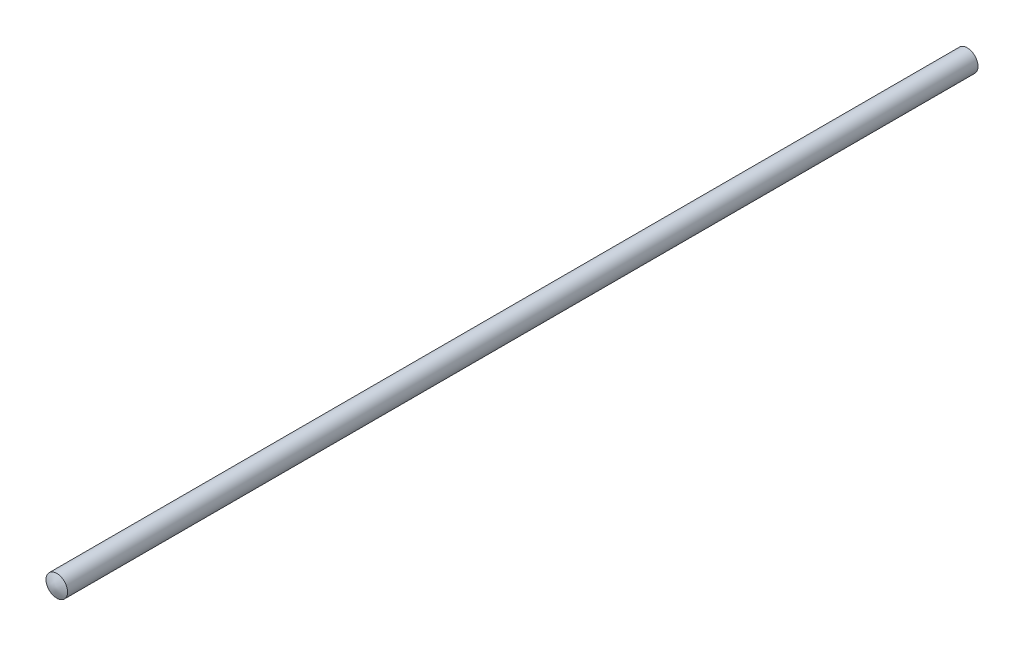
ISO-10303-21;
HEADER;
FILE_DESCRIPTION(('STEP AP214'),'2;1');
FILE_NAME('part.step','',(''),(''),'','','');
FILE_SCHEMA(('AUTOMOTIVE_DESIGN { 1 0 10303 214 1 1 1 1 }'));
ENDSEC;
DATA;
#1=APPLICATION_CONTEXT('core data for automotive mechanical design processes');
#2=APPLICATION_PROTOCOL_DEFINITION('international standard','automotive_design',2000,#1);
#3=PRODUCT_CONTEXT('',#1,'mechanical');
#4=PRODUCT('Part','Part','',(#3));
#5=PRODUCT_RELATED_PRODUCT_CATEGORY('part','',(#4));
#6=PRODUCT_DEFINITION_FORMATION('','',#4);
#7=PRODUCT_DEFINITION_CONTEXT('part definition',#1,'design');
#8=PRODUCT_DEFINITION('design','',#6,#7);
#9=PRODUCT_DEFINITION_SHAPE('','',#8);
#10=(LENGTH_UNIT() NAMED_UNIT(*) SI_UNIT(.MILLI.,.METRE.));
#11=(NAMED_UNIT(*) PLANE_ANGLE_UNIT() SI_UNIT($,.RADIAN.));
#12=(NAMED_UNIT(*) SI_UNIT($,.STERADIAN.) SOLID_ANGLE_UNIT());
#13=UNCERTAINTY_MEASURE_WITH_UNIT(LENGTH_MEASURE(1.E-05),#10,'distance_accuracy_value','');
#14=(GEOMETRIC_REPRESENTATION_CONTEXT(3) GLOBAL_UNCERTAINTY_ASSIGNED_CONTEXT((#13)) GLOBAL_UNIT_ASSIGNED_CONTEXT((#10,
#11,#12)) REPRESENTATION_CONTEXT('',''));
#15=CARTESIAN_POINT('',(0.,0.,0.));
#16=DIRECTION('',(0.,0.,1.));
#17=DIRECTION('',(1.,0.,0.));
#18=AXIS2_PLACEMENT_3D('',#15,#16,#17);
#19=CARTESIAN_POINT('',(0.,1.11022302462516E-13,268.));
#20=DIRECTION('',(0.,0.,-1.));
#21=DIRECTION('',(-1.,0.,0.));
#22=AXIS2_PLACEMENT_3D('',#19,#20,#21);
#23=CYLINDRICAL_SURFACE('',#22,6.35);
#24=CARTESIAN_POINT('',(-6.34999999999719,-1.55431223447522E-12,268.000096406483));
#25=CARTESIAN_POINT('',(-6.35000128044911,-0.178405354103465,268.000095801648));
#26=CARTESIAN_POINT('',(-6.34247837398455,-0.356789699393443,268.000106324726));
#27=CARTESIAN_POINT('',(-6.3124392573701,-0.712350020998407,268.00013407479));
#28=CARTESIAN_POINT('',(-6.28991910287816,-0.889525667032637,268.000151303539));
#29=CARTESIAN_POINT('',(-6.23001326713247,-1.24150541697179,268.000149018285));
#30=CARTESIAN_POINT('',(-6.19261434982376,-1.41630726559039,268.000129471508));
#31=CARTESIAN_POINT('',(-6.10320132114421,-1.76220134522993,268.000085831834));
#32=CARTESIAN_POINT('',(-6.05118186583848,-1.93329219517198,268.000061737275));
#33=CARTESIAN_POINT('',(-5.93295397138,-2.27033579232568,268.000040936433));
#34=CARTESIAN_POINT('',(-5.86675759671156,-2.43629277185692,268.000044206951));
#35=CARTESIAN_POINT('',(-5.72059302178718,-2.76210175417579,268.000063981226));
#36=CARTESIAN_POINT('',(-5.64061968339386,-2.92195145197132,268.000080489927));
#37=CARTESIAN_POINT('',(-5.46754457787675,-3.23423947736638,268.000114014888));
#38=CARTESIAN_POINT('',(-5.37445153748528,-3.38668264160138,268.000131030804));
#39=CARTESIAN_POINT('',(-5.17571341101149,-3.6832550926358,268.000159153254));
#40=CARTESIAN_POINT('',(-5.07006265776027,-3.82738058183333,268.000170257107));
#41=CARTESIAN_POINT('',(-4.84698238495348,-4.10623256862649,268.000186513628));
#42=CARTESIAN_POINT('',(-4.72955163297828,-4.24095808029434,268.000191665673));
#43=CARTESIAN_POINT('',(-4.4838115392967,-4.49997659868937,268.000197052873));
#44=CARTESIAN_POINT('',(-4.35550714750611,-4.62427430164526,268.000197290253));
#45=CARTESIAN_POINT('',(-4.0888251778504,-4.86167591883434,268.000192049633));
#46=CARTESIAN_POINT('',(-3.9504430631059,-4.97477473671141,268.000186569044));
#47=CARTESIAN_POINT('',(-3.66469484160733,-5.1888700178347,268.000168404349));
#48=CARTESIAN_POINT('',(-3.51733211562199,-5.28987099339232,268.000155722939));
#49=CARTESIAN_POINT('',(-3.21456961515029,-5.47913541811532,268.000125361114));
#50=CARTESIAN_POINT('',(-3.05916701950378,-5.56739435440086,268.000107678934));
#51=CARTESIAN_POINT('',(-2.7415367014403,-5.73047430947266,268.000077780013));
#52=CARTESIAN_POINT('',(-2.57931152158411,-5.80530028047754,268.000065561255));
#53=CARTESIAN_POINT('',(-2.2491050298462,-5.94103504620717,268.000060599971));
#54=CARTESIAN_POINT('',(-2.08112267136192,-6.00194129485516,268.000067861005));
#55=CARTESIAN_POINT('',(-1.74062422022812,-6.10938607651981,268.000108662651));
#56=CARTESIAN_POINT('',(-1.56810812757804,-6.15592460953471,268.000142203262));
#57=CARTESIAN_POINT('',(-1.21976835283598,-6.23430318215571,268.000176704424));
#58=CARTESIAN_POINT('',(-1.04394466476752,-6.26614319520047,268.000177664915));
#59=CARTESIAN_POINT('',(-0.690240014959518,-6.31489823611969,268.00015853037));
#60=CARTESIAN_POINT('',(-0.512359053216305,-6.33181326396757,268.000138435333));
#61=CARTESIAN_POINT('',(-0.155804802612847,-6.35059806281717,268.000115503974));
#62=CARTESIAN_POINT('',(0.0228684848161311,-6.35246786098573,268.000112667621));
#63=CARTESIAN_POINT('',(0.37973744518868,-6.34114897839931,268.00012734329));
#64=CARTESIAN_POINT('',(0.557933118133068,-6.32796029767009,268.000144855311));
#65=CARTESIAN_POINT('',(0.912580057989008,-6.28661821288181,268.000172443957));
#66=CARTESIAN_POINT('',(1.08903132424237,-6.25846480317653,268.00018252058));
#67=CARTESIAN_POINT('',(1.43893491855304,-6.18739341051373,268.000160174334));
#68=CARTESIAN_POINT('',(1.61238724659973,-6.14447542750388,268.000127751465));
#69=CARTESIAN_POINT('',(1.95506000452752,-6.04417995815779,268.000080721031));
#70=CARTESIAN_POINT('',(2.12428042994984,-5.98680245658748,268.000066113484));
#71=CARTESIAN_POINT('',(2.45728615113507,-5.85799588120962,268.000060242739));
#72=CARTESIAN_POINT('',(2.62107144690616,-5.78656680742321,268.00006897954));
#73=CARTESIAN_POINT('',(2.94201233270917,-5.63017961448241,268.00009531583));
#74=CARTESIAN_POINT('',(3.09916916027457,-5.54522403499283,268.000112913656));
#75=CARTESIAN_POINT('',(3.40582633604658,-5.36234368642265,268.000144916558));
#76=CARTESIAN_POINT('',(3.55532379587368,-5.26441407397773,268.000159320436));
#77=CARTESIAN_POINT('',(3.84547557789217,-5.0563498819842,268.000180905236));
#78=CARTESIAN_POINT('',(3.98613353557804,-4.94622037215953,268.000188089145));
#79=CARTESIAN_POINT('',(4.25773581982436,-4.71445341684494,268.000196304423));
#80=CARTESIAN_POINT('',(4.38867571567909,-4.59281077904374,268.000197333002));
#81=CARTESIAN_POINT('',(4.63984011021247,-4.33892488552416,268.000194476317));
#82=CARTESIAN_POINT('',(4.76006460534527,-4.20668162629794,268.000190591052));
#83=CARTESIAN_POINT('',(4.98889115860331,-3.93259730485286,268.000177191566));
#84=CARTESIAN_POINT('',(5.09749845648826,-3.7907606171263,268.000167679897));
#85=CARTESIAN_POINT('',(5.30242367347464,-3.49838334469239,268.000142357172));
#86=CARTESIAN_POINT('',(5.39873648733996,-3.34783918170149,268.000126543511));
#87=CARTESIAN_POINT('',(5.57830141571896,-3.03922891557393,268.000093008299));
#88=CARTESIAN_POINT('',(5.66155840445128,-2.88116564845726,268.000075287464));
#89=CARTESIAN_POINT('',(5.81447774706051,-2.55855808077407,268.000049756971));
#90=CARTESIAN_POINT('',(5.88413755372414,-2.39401257278945,268.000041949168));
#91=CARTESIAN_POINT('',(6.00934784725865,-2.05963817874094,268.000050728739));
#92=CARTESIAN_POINT('',(6.06489833409647,-1.88980929266469,268.000067316113));
#93=CARTESIAN_POINT('',(6.16149506649238,-1.54607551536307,268.000112167783));
#94=CARTESIAN_POINT('',(6.2025413126803,-1.37217062431472,268.000140432078));
#95=CARTESIAN_POINT('',(6.26983775035469,-1.02152119126335,268.000156178578));
#96=CARTESIAN_POINT('',(6.29608794186501,-0.844776649264917,268.000143660783));
#97=CARTESIAN_POINT('',(6.33360564411269,-0.489704494952109,268.000116876781));
#98=CARTESIAN_POINT('',(6.34487315749947,-0.311376882917679,268.000102610575));
#99=CARTESIAN_POINT('',(6.35234540677523,0.0455936422165156,268.000093588381));
#100=CARTESIAN_POINT('',(6.34855014265971,0.224236555316374,268.000098832393));
#101=CARTESIAN_POINT('',(6.32592381878535,0.580567644878638,268.00012280646));
#102=CARTESIAN_POINT('',(6.30709275833806,0.758255821297329,268.000141536516));
#103=CARTESIAN_POINT('',(6.25452871736142,1.11141417665586,268.000152213018));
#104=CARTESIAN_POINT('',(6.22079573684664,1.28688435559786,268.000144159465));
#105=CARTESIAN_POINT('',(6.13866767781263,1.63435923263122,268.000106266317));
#106=CARTESIAN_POINT('',(6.09027259824489,1.80636393047475,268.00007642672));
#107=CARTESIAN_POINT('',(5.97916439014131,2.1456850043661,268.000044334604));
#108=CARTESIAN_POINT('',(5.91645126164024,2.31300138042531,268.000042082084));
#109=CARTESIAN_POINT('',(5.77716571543426,2.64172585672441,268.000054281404));
#110=CARTESIAN_POINT('',(5.70059586031722,2.8031350427836,268.000068730159));
#111=CARTESIAN_POINT('',(5.53410246561002,3.11898902968556,268.00010103757));
#112=CARTESIAN_POINT('',(5.44417400496736,3.27343123657836,268.000118897483));
#113=CARTESIAN_POINT('',(5.25165953228186,3.57413365525464,268.000149473351));
#114=CARTESIAN_POINT('',(5.14907820686649,3.72039686754073,268.000162191202));
#115=CARTESIAN_POINT('',(4.93192063415114,4.0038158672111,268.000181412434));
#116=CARTESIAN_POINT('',(4.81733997223598,4.14096827214091,268.000187913519));
#117=CARTESIAN_POINT('',(4.57707432231983,4.40508228156732,268.000195858094));
#118=CARTESIAN_POINT('',(4.45139344364149,4.53204762439025,268.000197303449));
#119=CARTESIAN_POINT('',(4.18973601270205,4.77498636732874,268.000194861082));
#120=CARTESIAN_POINT('',(4.0537556764025,4.89095569190481,268.000190971391));
#121=CARTESIAN_POINT('',(3.77255916155188,5.1109839230657,268.000176216915));
#122=CARTESIAN_POINT('',(3.62734640584466,5.21504720412154,268.000165354701));
#123=CARTESIAN_POINT('',(3.32861673459316,5.41060933056712,268.000137423009));
#124=CARTESIAN_POINT('',(3.17509677287339,5.50210352286921,268.000120351241));
#125=CARTESIAN_POINT('',(2.86095193734431,5.67179982252483,268.000088397309));
#126=CARTESIAN_POINT('',(2.70032971514227,5.7500068386722,268.000073514336));
#127=CARTESIAN_POINT('',(2.37300833875286,5.89264066931354,268.000059594805));
#128=CARTESIAN_POINT('',(2.2063069614118,5.9570623821417,268.000060564103));
#129=CARTESIAN_POINT('',(1.86813202464055,6.07160948774153,268.000091073785));
#130=CARTESIAN_POINT('',(1.69666026432286,6.12174019213395,268.000120603537));
#131=CARTESIAN_POINT('',(1.35003874039485,6.20739705177218,268.000163934263));
#132=CARTESIAN_POINT('',(1.17488762424494,6.24291773398119,268.000177729346));
#133=CARTESIAN_POINT('',(0.822288059488215,6.2990633413381,268.000171159408));
#134=CARTESIAN_POINT('',(0.644840586481541,6.31969439366234,268.000150808449));
#135=CARTESIAN_POINT('',(0.288757748489359,6.34594393037993,268.000122088804));
#136=CARTESIAN_POINT('',(0.110121881647268,6.35155560757303,268.000113725552));
#137=CARTESIAN_POINT('',(-0.246987092049549,6.34770688732131,268.000118865595));
#138=CARTESIAN_POINT('',(-0.425460199196028,6.33824651694703,268.00013236885));
#139=CARTESIAN_POINT('',(-0.780893952307786,6.30432876135995,268.000163023849));
#140=CARTESIAN_POINT('',(-0.95785524672531,6.27987817097655,268.000180173937));
#141=CARTESIAN_POINT('',(-1.30916289617733,6.21614634665356,268.000171941768));
#142=CARTESIAN_POINT('',(-1.48350813351879,6.17685895139737,268.000146541826));
#143=CARTESIAN_POINT('',(-1.82820374464671,6.08375132870037,268.000098702034));
#144=CARTESIAN_POINT('',(-1.99855558859273,6.02993654379511,268.00007626108));
#145=CARTESIAN_POINT('',(-2.33418695063881,5.90812620078526,268.000058247329));
#146=CARTESIAN_POINT('',(-2.49946446179279,5.84012511268158,268.000062685029));
#147=CARTESIAN_POINT('',(-2.82364201922553,5.69046625966567,268.000083836489));
#148=CARTESIAN_POINT('',(-2.98254439830485,5.60881354775333,268.000100545715));
#149=CARTESIAN_POINT('',(-3.29295831571037,5.43238501444194,268.000133157001));
#150=CARTESIAN_POINT('',(-3.44446739764313,5.3376048711143,268.000149058794));
#151=CARTESIAN_POINT('',(-3.73890656553081,5.13565338548851,268.000173930542));
#152=CARTESIAN_POINT('',(-3.88183979754855,5.02848662998301,268.000182903054));
#153=CARTESIAN_POINT('',(-4.1582088291503,4.80246541356236,268.000194258049));
#154=CARTESIAN_POINT('',(-4.29164210937315,4.68360787203839,268.000196638791));
#155=CARTESIAN_POINT('',(-4.547973494064,4.43511988942894,268.000196348411));
#156=CARTESIAN_POINT('',(-4.67087546705592,4.30549343890768,268.000193679154));
#157=CARTESIAN_POINT('',(-4.9053986790255,4.03626737587944,268.000183026175));
#158=CARTESIAN_POINT('',(-5.01701290008786,3.89666164991002,268.000175039171));
#159=CARTESIAN_POINT('',(-5.22804103356964,3.60859450165775,268.000152700593));
#160=CARTESIAN_POINT('',(-5.32745942725098,3.4601363621033,268.000138351366));
#161=CARTESIAN_POINT('',(-5.51351589761563,3.15524375001055,268.000105832891));
#162=CARTESIAN_POINT('',(-5.60014309436264,2.99880263775733,268.000087660424));
#163=CARTESIAN_POINT('',(-5.75987045980536,2.67923329490444,268.00005803331));
#164=CARTESIAN_POINT('',(-5.83297556247695,2.51610753006272,268.00004657621));
#165=CARTESIAN_POINT('',(-5.96511918419794,2.18442014022354,268.00004413271));
#166=CARTESIAN_POINT('',(-6.02417017741873,2.01586348762059,268.000053128081));
#167=CARTESIAN_POINT('',(-6.12785491177576,1.6744327375732,268.000094305633));
#168=CARTESIAN_POINT('',(-6.17249244111451,1.501559787444,268.000126481715));
#169=CARTESIAN_POINT('',(-6.25633862735126,1.10921046909331,268.000157149938));
#170=CARTESIAN_POINT('',(-6.29143183547369,0.888842562761136,268.000145266861));
#171=CARTESIAN_POINT('',(-6.3382617222534,0.445638848839426,268.00011527281));
#172=CARTESIAN_POINT('',(-6.34999840089394,0.22280304124812,268.000097161836));
#173=CARTESIAN_POINT('',(-6.34999999999719,-1.55431223447522E-12,268.000096406483));
#174=B_SPLINE_CURVE_WITH_KNOTS('',3,(#24,#25,#26,#27,#28,#29,#30,#31,#32,#33,#34,#35,#36,#37,
#38,#39,#40,#41,#42,#43,#44,#45,#46,#47,#48,#49,#50,#51,#52,#53,#54,#55,#56,#57,#58,#59,#60,#61,
#62,#63,#64,#65,#66,#67,#68,#69,#70,#71,#72,#73,#74,#75,#76,#77,#78,#79,#80,#81,#82,#83,#84,#85,
#86,#87,#88,#89,#90,#91,#92,#93,#94,#95,#96,#97,#98,#99,#100,#101,#102,#103,#104,#105,#106,#107,
#108,#109,#110,#111,#112,#113,#114,#115,#116,#117,#118,#119,#120,#121,#122,#123,#124,#125,#126,
#127,#128,#129,#130,#131,#132,#133,#134,#135,#136,#137,#138,#139,#140,#141,#142,#143,#144,#145,
#146,#147,#148,#149,#150,#151,#152,#153,#154,#155,#156,#157,#158,#159,#160,#161,#162,#163,#164,
#165,#166,#167,#168,#169,#170,#171,#172,#173),.UNSPECIFIED.,.T.,.F.,(4,2,2,2,2,2,2,2,2,2,2,2,2,
2,2,2,2,2,2,2,2,2,2,2,2,2,2,2,2,2,2,2,2,2,2,2,2,2,2,2,2,2,2,2,2,2,2,2,2,2,2,2,2,2,2,2,2,2,2,2,2,
2,2,2,2,2,2,2,2,2,2,2,2,2,4),(0.,0.535021449120727,1.07018366683247,1.60582302989691,
2.14165842902484,2.67703963419656,3.21262094451063,3.7478476730991,4.28331686779797,
4.8188421416505,5.35412492898694,5.88965020239996,6.4249751068961,6.96048914605857,
7.4958053545066,8.03121940019943,8.56663344595775,9.10204845924639,9.63746347348854,
10.1728775209437,10.7082915674829,11.2437058160348,11.779120066484,12.3145348810297,
12.8499496947695,13.3852641001565,13.9207789110146,14.4560720151313,14.991607692234,
15.5271435465512,16.0624368279235,16.5979516696218,17.133266105537,17.6686807279563,
18.2040953516297,18.7395099520533,19.2749245516136,19.8103390564948,20.3457535615358,
20.8811680910917,21.4165826201238,21.9519971874448,22.487411753466,23.0227274038196,
23.5582407454219,24.093556324932,24.6290695462215,25.1643853438134,25.6998987803731,
26.2352148245412,26.7707285121895,27.306043928249,27.8415571125492,28.3768709993269,
28.9123852369348,29.4476789812204,29.983215294529,30.518750645975,31.0540434270183,
31.589558745293,32.1248737160816,32.6603977505905,33.1957240037674,33.7312269225723,
34.2665321748408,34.8019788638455,35.3372280134244,35.8728079227482,36.408190444157,
36.9440257599547,37.4796651714432,38.014827371181,38.5498488028115,39.2180148817535,
39.886180961174),.UNSPECIFIED.);
#175=CARTESIAN_POINT('',(-6.34999999999719,-1.55431223447522E-12,268.000096406483));
#176=VERTEX_POINT('',#175);
#177=EDGE_CURVE('E14',#176,#176,#174,.T.);
#178=ORIENTED_EDGE('',*,*,#177,.F.);
#179=EDGE_LOOP('',(#178));
#180=FACE_BOUND('',#179,.T.);
#181=CARTESIAN_POINT('',(-6.3500000000003,-6.10622663543836E-13,-268.000096406481));
#182=CARTESIAN_POINT('',(-6.35000128045183,-0.178405354100143,-268.000095802054));
#183=CARTESIAN_POINT('',(-6.34247837398596,-0.356789699387569,-268.00010632553));
#184=CARTESIAN_POINT('',(-6.31243925737131,-0.712350020987772,-268.000134074914));
#185=CARTESIAN_POINT('',(-6.28991910288046,-0.889525667019795,-268.000151302584));
#186=CARTESIAN_POINT('',(-6.23001326713667,-1.24150541695404,-268.000149012923));
#187=CARTESIAN_POINT('',(-6.19261434982876,-1.41630726556994,-268.000129462816));
#188=CARTESIAN_POINT('',(-6.10320132115245,-1.7622013452045,-268.000085816983));
#189=CARTESIAN_POINT('',(-6.05118186584917,-1.93329219514428,-268.000061719596));
#190=CARTESIAN_POINT('',(-5.93295397139402,-2.27033579229401,-268.000040916141));
#191=CARTESIAN_POINT('',(-5.86675759672641,-2.43629277182355,-268.000044186872));
#192=CARTESIAN_POINT('',(-5.72059302180512,-2.76210175413952,-268.000063964394));
#193=CARTESIAN_POINT('',(-5.64061968341404,-2.92195145193386,-268.000080476133));
#194=CARTESIAN_POINT('',(-5.46754457790129,-3.23423947732612,-268.000114008346));
#195=CARTESIAN_POINT('',(-5.37445153751196,-3.38668264155954,-268.000131028476));
#196=CARTESIAN_POINT('',(-5.17571341104386,-3.68325509259214,-268.000159158441));
#197=CARTESIAN_POINT('',(-5.07006265779621,-3.82738058178945,-268.000170265594));
#198=CARTESIAN_POINT('',(-4.84698238499834,-4.10623256857681,-268.000186526434));
#199=CARTESIAN_POINT('',(-4.72955163302886,-4.24095808023935,-268.000191679497));
#200=CARTESIAN_POINT('',(-4.48381153936059,-4.49997659862581,-268.000197066435));
#201=CARTESIAN_POINT('',(-4.35550714757758,-4.62427430157842,-268.000197302536));
#202=CARTESIAN_POINT('',(-4.08882517793749,-4.86167591876194,-268.000192058226));
#203=CARTESIAN_POINT('',(-3.95044306320102,-4.97477473663673,-268.000186575226));
#204=CARTESIAN_POINT('',(-3.66469484171891,-5.18887001775627,-268.000168406176));
#205=CARTESIAN_POINT('',(-3.517332115742,-5.28987099331244,-268.000155722822));
#206=CARTESIAN_POINT('',(-3.21456961528399,-5.47913541803697,-268.000125358741));
#207=CARTESIAN_POINT('',(-3.05916701964253,-5.56739435432515,-268.00010767625));
#208=CARTESIAN_POINT('',(-2.74153670158865,-5.73047430940245,-268.000077778589));
#209=CARTESIAN_POINT('',(-2.57931152173703,-5.80530028041018,-268.000065561401));
#210=CARTESIAN_POINT('',(-2.24910503000837,-5.94103504614638,-268.000060604415));
#211=CARTESIAN_POINT('',(-2.08112267152878,-6.00194129479807,-268.000067868177));
#212=CARTESIAN_POINT('',(-1.74062422040433,-6.10938607646989,-268.000108675059));
#213=CARTESIAN_POINT('',(-1.56810812775891,-6.15592460948827,-268.000142218178));
#214=CARTESIAN_POINT('',(-1.21976835302677,-6.23430318211793,-268.000176722101));
#215=CARTESIAN_POINT('',(-1.0439446649636,-6.26614319516799,-268.000177682847));
#216=CARTESIAN_POINT('',(-0.690240015165974,-6.31489823609774,-268.000158545466));
#217=CARTESIAN_POINT('',(-0.512359053427854,-6.33181326395084,-268.00013844734));
#218=CARTESIAN_POINT('',(-0.155804802833985,-6.35059806281206,-268.000115508082));
#219=CARTESIAN_POINT('',(0.0228684845904968,-6.35246786098701,-268.000112666919));
#220=CARTESIAN_POINT('',(0.379737444955152,-6.34114897841344,-268.000127334032));
#221=CARTESIAN_POINT('',(0.557933117896142,-6.32796029769068,-268.000144842308));
#222=CARTESIAN_POINT('',(0.912580057740378,-6.28661821291744,-268.00017242662));
#223=CARTESIAN_POINT('',(1.08903132398548,-6.25846480322117,-268.000182502653));
#224=CARTESIAN_POINT('',(1.43893491828078,-6.18739341057723,-268.000160157982));
#225=CARTESIAN_POINT('',(1.61238724632035,-6.14447542757724,-268.000127737277));
#226=CARTESIAN_POINT('',(1.95506000423515,-6.04417995825233,-268.000080711828));
#227=CARTESIAN_POINT('',(2.12428042965159,-5.98680245669334,-268.000066107102));
#228=CARTESIAN_POINT('',(2.45728615082604,-5.8579958813391,-268.000060241135));
#229=CARTESIAN_POINT('',(2.62107144659222,-5.78656680756498,-268.000068979894));
#230=CARTESIAN_POINT('',(2.94201233240275,-5.63017961464259,-268.000095318313));
#231=CARTESIAN_POINT('',(3.09916915997996,-5.54522403515781,-268.000112916313));
#232=CARTESIAN_POINT('',(3.40582633577544,-5.36234368659529,-268.000144917771));
#233=CARTESIAN_POINT('',(3.55532379561421,-5.26441407415322,-268.000159320032));
#234=CARTESIAN_POINT('',(3.84547557765609,-5.05634988216411,-268.000180900774));
#235=CARTESIAN_POINT('',(3.98613353535367,-4.946220372341,-268.000188082244));
#236=CARTESIAN_POINT('',(4.25773581962224,-4.71445341702732,-268.000196293381));
#237=CARTESIAN_POINT('',(4.38867571548749,-4.59281077922546,-268.000197320258));
#238=CARTESIAN_POINT('',(4.63984011003645,-4.33892488571056,-268.000194462267));
#239=CARTESIAN_POINT('',(4.76006460517481,-4.2066816264902,-268.000190577396));
#240=CARTESIAN_POINT('',(4.98889115844364,-3.93259730505553,-268.000177181119));
#241=CARTESIAN_POINT('',(5.09749845633381,-3.79076061733352,-268.000167672263));
#242=CARTESIAN_POINT('',(5.30242367333181,-3.49838334490855,-268.000142356523));
#243=CARTESIAN_POINT('',(5.39873648720354,-3.34783918192203,-268.000126547035));
#244=CARTESIAN_POINT('',(5.5783014155939,-3.03922891580168,-268.000093019518));
#245=CARTESIAN_POINT('',(5.66155840433116,-2.88116564868785,-268.000075302205));
#246=CARTESIAN_POINT('',(5.81447774695465,-2.5585580810086,-268.00004977623));
#247=CARTESIAN_POINT('',(5.88413755362736,-2.39401257302497,-268.000041969423));
#248=CARTESIAN_POINT('',(6.00934784717806,-2.05963817897692,-268.000050747833));
#249=CARTESIAN_POINT('',(6.06489833402302,-1.88980929290013,-268.000067333052));
#250=CARTESIAN_POINT('',(6.16149506643311,-1.54607551559666,-268.000112178947));
#251=CARTESIAN_POINT('',(6.20254131262808,-1.37217062454697,-268.000140439624));
#252=CARTESIAN_POINT('',(6.26983775031727,-1.02152119149304,-268.000156180881));
#253=CARTESIAN_POINT('',(6.29608794183533,-0.844776649493383,-268.000143661461));
#254=CARTESIAN_POINT('',(6.33360564409677,-0.48970449517146,-268.00011687598));
#255=CARTESIAN_POINT('',(6.34487315748911,-0.31137688312909,-268.00010260992));
#256=CARTESIAN_POINT('',(6.35234540677595,0.0455936420213128,-268.000093588436));
#257=CARTESIAN_POINT('',(6.34855014266597,0.22423655512944,-268.000098833013));
#258=CARTESIAN_POINT('',(6.32592381880054,0.58056764470873,-268.000122807038));
#259=CARTESIAN_POINT('',(6.30709275835666,0.758255821136178,-268.000141536487));
#260=CARTESIAN_POINT('',(6.25452871738687,1.11141417651246,-268.000152209547));
#261=CARTESIAN_POINT('',(6.22079573687553,1.28688435546346,-268.000144153157));
#262=CARTESIAN_POINT('',(6.13866767784786,1.63435923250181,-268.000106253832));
#263=CARTESIAN_POINT('',(6.09027259828401,1.80636393034157,-268.000076410895));
#264=CARTESIAN_POINT('',(5.97916439018999,2.14568500422671,-268.000044314853));
#265=CARTESIAN_POINT('',(5.9164512616946,2.31300138028348,-268.000042061748));
#266=CARTESIAN_POINT('',(5.77716571550046,2.6417258565781,-268.000054262924));
#267=CARTESIAN_POINT('',(5.7005958603896,2.80313504263525,-268.000068714118));
#268=CARTESIAN_POINT('',(5.53410246569453,3.11898902953319,-268.000101028094));
#269=CARTESIAN_POINT('',(5.44417400505781,3.273431236424,-268.000118892134));
#270=CARTESIAN_POINT('',(5.25165953239098,3.57413365509023,-268.000149475825));
#271=CARTESIAN_POINT('',(5.14907820698901,3.72039686736868,-268.000162197374));
#272=CARTESIAN_POINT('',(4.93192063430106,4.00381586702519,-268.000181423947));
#273=CARTESIAN_POINT('',(4.81733997239988,4.14096827194877,-268.000187926674));
#274=CARTESIAN_POINT('',(4.57707432251305,4.40508228136473,-268.00019587211));
#275=CARTESIAN_POINT('',(4.45139344385005,4.53204762418343,-268.000197316683));
#276=CARTESIAN_POINT('',(4.18973601294295,4.7749863671163,-268.000194871256));
#277=CARTESIAN_POINT('',(4.05375567666041,4.89095569169098,-268.000190979286));
#278=CARTESIAN_POINT('',(3.77255916183812,5.1109839228546,-268.000176220334));
#279=CARTESIAN_POINT('',(3.62734640614185,5.21504720391408,-268.000165355924));
#280=CARTESIAN_POINT('',(3.32861673491268,5.41060933036921,-268.000137421256));
#281=CARTESIAN_POINT('',(3.17509677320427,5.50210352267722,-268.000120348708));
#282=CARTESIAN_POINT('',(2.86095193769721,5.67179982234594,-268.000088395133));
#283=CARTESIAN_POINT('',(2.70032971550581,5.75000683850049,-268.000073513296));
#284=CARTESIAN_POINT('',(2.37300833913737,5.89264066915789,-268.00005959745));
#285=CARTESIAN_POINT('',(2.20630696180662,5.95706238199492,-268.000060569299));
#286=CARTESIAN_POINT('',(1.8681320250541,6.07160948761386,-268.000091084253));
#287=CARTESIAN_POINT('',(1.69666026474478,6.12174019201639,-268.000120616725));
#288=CARTESIAN_POINT('',(1.35003874083248,6.20739705167616,-268.000163951189));
#289=CARTESIAN_POINT('',(1.17488762468993,6.24291773389664,-268.00017774729));
#290=CARTESIAN_POINT('',(0.822288059947184,6.29906334127763,-268.000171176044));
#291=CARTESIAN_POINT('',(0.644840586947141,6.31969439361449,-268.000150822762));
#292=CARTESIAN_POINT('',(0.288757748967184,6.34594393035726,-268.000122096165));
#293=CARTESIAN_POINT('',(0.110121882130684,6.35155560756291,-268.000113728283));
#294=CARTESIAN_POINT('',(-0.246987091556563,6.34770688733877,-268.000118859432));
#295=CARTESIAN_POINT('',(-0.425460198699064,6.33824651697955,-268.000132358425));
#296=CARTESIAN_POINT('',(-0.780893951803881,6.30432876142216,-268.000163007705));
#297=CARTESIAN_POINT('',(-0.957855246218439,6.27987817105338,-268.000180156336));
#298=CARTESIAN_POINT('',(-1.3091628956661,6.21614634676075,-268.000171924382));
#299=CARTESIAN_POINT('',(-1.48350813300617,6.1768589515203,-268.000146526114));
#300=CARTESIAN_POINT('',(-1.82820374413251,6.08375132885422,-268.000098690817));
#301=CARTESIAN_POINT('',(-1.99855558807835,6.02993654396415,-268.000076252685));
#302=CARTESIAN_POINT('',(-2.33418695013429,5.90812620098343,-268.000058244043));
#303=CARTESIAN_POINT('',(-2.49946446129807,5.84012511289294,-268.00006268403));
#304=CARTESIAN_POINT('',(-2.82364201875096,5.69046625990142,-268.000083838431));
#305=CARTESIAN_POINT('',(-2.98254439784064,5.60881354800028,-268.000100548311));
#306=CARTESIAN_POINT('',(-3.29295831526791,5.43238501471008,-268.000133159025));
#307=CARTESIAN_POINT('',(-3.44446739721206,5.33760487139243,-268.00014905959));
#308=CARTESIAN_POINT('',(-3.73890656512326,5.13565338578547,-268.00017392774));
#309=CARTESIAN_POINT('',(-3.88183979715312,5.02848663028881,-268.000182897882));
#310=CARTESIAN_POINT('',(-4.15820882877895,4.80246541388451,-268.000194248473));
#311=CARTESIAN_POINT('',(-4.29164210901377,4.68360787236807,-268.00019662718));
#312=CARTESIAN_POINT('',(-4.547973493729,4.4351198897726,-268.00019633456));
#313=CARTESIAN_POINT('',(-4.67087546673334,4.30549343925776,-268.000193665096));
#314=CARTESIAN_POINT('',(-4.9053986787283,4.03626737624129,-268.000183014169));
#315=CARTESIAN_POINT('',(-5.01701289980363,3.89666165027721,-268.000175029426));
#316=CARTESIAN_POINT('',(-5.22804103331028,3.60859450203328,-268.000152697109));
#317=CARTESIAN_POINT('',(-5.32745942700352,3.46013636248181,-268.000138351881));
#318=CARTESIAN_POINT('',(-5.51351589739524,3.15524375039319,-268.000105841298));
#319=CARTESIAN_POINT('',(-5.60014309415727,2.99880263814102,-268.000087672722));
#320=CARTESIAN_POINT('',(-5.75987045962783,2.67923329528822,-268.000058051234));
#321=CARTESIAN_POINT('',(-5.83297556231224,2.51610753044553,-268.00004659587));
#322=CARTESIAN_POINT('',(-5.96511918405955,2.1844201406035,-268.000044152704));
#323=CARTESIAN_POINT('',(-6.02417017729383,2.01586348799866,-268.000053146676));
#324=CARTESIAN_POINT('',(-6.12785491167386,1.67443273794486,-268.000094319184));
#325=CARTESIAN_POINT('',(-6.17249244102213,1.50155978781115,-268.000126491621));
#326=CARTESIAN_POINT('',(-6.25633862729519,1.109210469398,-268.000157153318));
#327=CARTESIAN_POINT('',(-6.29143183543974,0.888842563006854,-268.000145267774));
#328=CARTESIAN_POINT('',(-6.33826172224927,0.445638848964137,-268.000115271778));
#329=CARTESIAN_POINT('',(-6.34999840089754,0.222803041310802,-268.000097161326));
#330=CARTESIAN_POINT('',(-6.3500000000003,-6.10622663543836E-13,-268.000096406481));
#331=B_SPLINE_CURVE_WITH_KNOTS('',3,(#181,#182,#183,#184,#185,#186,#187,#188,#189,#190,#191,
#192,#193,#194,#195,#196,#197,#198,#199,#200,#201,#202,#203,#204,#205,#206,#207,#208,#209,#210,
#211,#212,#213,#214,#215,#216,#217,#218,#219,#220,#221,#222,#223,#224,#225,#226,#227,#228,#229,
#230,#231,#232,#233,#234,#235,#236,#237,#238,#239,#240,#241,#242,#243,#244,#245,#246,#247,#248,
#249,#250,#251,#252,#253,#254,#255,#256,#257,#258,#259,#260,#261,#262,#263,#264,#265,#266,#267,
#268,#269,#270,#271,#272,#273,#274,#275,#276,#277,#278,#279,#280,#281,#282,#283,#284,#285,#286,
#287,#288,#289,#290,#291,#292,#293,#294,#295,#296,#297,#298,#299,#300,#301,#302,#303,#304,#305,
#306,#307,#308,#309,#310,#311,#312,#313,#314,#315,#316,#317,#318,#319,#320,#321,#322,#323,#324,
#325,#326,#327,#328,#329,#330),.UNSPECIFIED.,.T.,.F.,(4,2,2,2,2,2,2,2,2,2,2,2,2,2,2,2,2,2,2,2,2,
2,2,2,2,2,2,2,2,2,2,2,2,2,2,2,2,2,2,2,2,2,2,2,2,2,2,2,2,2,2,2,2,2,2,2,2,2,2,2,2,2,2,2,2,2,2,2,2,
2,2,2,2,2,4),(0.,0.535021449113577,1.07018366681783,1.60582302987481,2.14165842899509,
2.67703963416066,3.21262094446939,3.74784767305174,4.28331686774428,4.81884214157357,
5.35412492888698,5.88965020227721,6.42497510675061,6.96048914590399,7.49580535434273,
8.03121940002641,8.5666334457754,9.10204845905074,9.63746347328022,10.1728775207224,
10.7082915672488,11.2437058157726,11.7791200661931,12.3145348807105,12.8499496944226,
13.3852640998339,13.9207789107161,14.4560720148572,14.9916076919843,15.5271435462998,
16.0624368276704,16.5979516693668,17.1332661052804,17.6686807277079,18.2040953513889,
18.7395099518198,19.2749245513877,19.8103390562934,20.345753561359,20.8811680909396,
21.4165826199963,21.9519971873048,22.4874117533128,23.0227274036534,23.5582407452429,
24.0935563247122,24.6290695459606,25.1643853435113,25.6998987800297,26.2352148241778,
26.7707285118063,27.3060439278462,27.8415571121271,28.3768709988908,28.9123852364837,
29.4476789807544,29.9832152940484,30.5187506454789,31.0540434265075,31.5895587447675,
32.1248737155406,32.660397750062,33.1957240032513,33.7312269220689,34.2665321743502,
34.8019788633665,35.3372280129572,35.8728079222924,36.4081904437127,36.9440257595283,
37.479665171035,38.0148273707915,38.5498488024403,39.2180148815678,39.8861809611734),.UNSPECIFIED.);
#332=CARTESIAN_POINT('',(-6.3500000000003,-6.10622663543836E-13,-268.000096406481));
#333=VERTEX_POINT('',#332);
#334=EDGE_CURVE('E151',#333,#333,#331,.T.);
#335=ORIENTED_EDGE('',*,*,#334,.T.);
#336=EDGE_LOOP('',(#335));
#337=FACE_BOUND('',#336,.T.);
#338=ADVANCED_FACE('F144',(#180,#337),#23,.T.);
#339=CARTESIAN_POINT('',(6.60152626654309,-6.59893563734015,266.792037470234));
#340=CARTESIAN_POINT('',(5.54528472415239,-6.59893563734038,267.069918715789));
#341=CARTESIAN_POINT('',(4.48904318176435,-6.59893563733988,267.322394054239));
#342=CARTESIAN_POINT('',(3.43280163937543,-6.59893563733971,267.55763564476));
#343=CARTESIAN_POINT('',(1.84843710897864,-6.59893563734038,267.824690428193));
#344=CARTESIAN_POINT('',(0.264072578584074,-6.5989356373401,267.898179473566));
#345=CARTESIAN_POINT('',(-0.264050409422456,-6.59893563733993,267.89817987497));
#346=CARTESIAN_POINT('',(-1.84841937344116,-6.59893563733965,267.824692986552));
#347=CARTESIAN_POINT('',(-3.43278833745542,-6.59893563734104,267.557638674193));
#348=CARTESIAN_POINT('',(-4.48903431346359,-6.59893563734026,267.322396124329));
#349=CARTESIAN_POINT('',(-5.54528028947354,-6.5989356373396,267.069919798439));
#350=CARTESIAN_POINT('',(-6.60152626548483,-6.59893563733976,266.792037389958));
#351=CARTESIAN_POINT('',(6.60152626654265,-5.54310859402207,267.06960379162));
#352=CARTESIAN_POINT('',(5.54528472415194,-5.54310859402252,267.392959623484));
#353=CARTESIAN_POINT('',(4.48904318176213,-5.54310859402329,267.690464668123));
#354=CARTESIAN_POINT('',(3.4328016393701,-5.54310859402174,267.972959405628));
#355=CARTESIAN_POINT('',(1.84843710897997,-5.54310859402185,268.296971680916));
#356=CARTESIAN_POINT('',(0.264072578582741,-5.54310859402207,268.386404921541));
#357=CARTESIAN_POINT('',(-0.2640504094229,-5.54310859402268,268.386405419807));
#358=CARTESIAN_POINT('',(-1.84841937344071,-5.54310859402241,268.29697480956));
#359=CARTESIAN_POINT('',(-3.4327883374532,-5.54310859402285,267.972963046937));
#360=CARTESIAN_POINT('',(-4.48903431346315,-5.54310859402218,267.690467103577));
#361=CARTESIAN_POINT('',(-5.54528028947443,-5.54310859402185,267.392960899864));
#362=CARTESIAN_POINT('',(-6.60152626548216,-5.54310859402274,267.069603730473));
#363=CARTESIAN_POINT('',(6.60152626654309,-4.48728155070444,267.321785692982));
#364=CARTESIAN_POINT('',(5.54528472415505,-4.4872815507046,267.690155716596));
#365=CARTESIAN_POINT('',(4.48904318175902,-4.48728155070505,268.031997151315));
#366=CARTESIAN_POINT('',(3.43280163937409,-4.48728155070532,268.362912408808));
#367=CARTESIAN_POINT('',(1.84843710897908,-4.48728155070499,268.745905505115));
#368=CARTESIAN_POINT('',(0.264072578582297,-4.48728155070577,268.851866756955));
#369=CARTESIAN_POINT('',(-0.264050409423344,-4.48728155070399,268.851867346727));
#370=CARTESIAN_POINT('',(-1.84841937344027,-4.48728155070477,268.745909231595));
#371=CARTESIAN_POINT('',(-3.43278833745275,-4.48728155070499,268.362916690054));
#372=CARTESIAN_POINT('',(-4.48903431346315,-4.4872815507051,268.031999935188));
#373=CARTESIAN_POINT('',(-5.54528028947043,-4.48728155070483,267.690157175561));
#374=CARTESIAN_POINT('',(-6.60152626548216,-4.48728155070399,267.321785671668));
#375=CARTESIAN_POINT('',(6.60152626654398,-3.4314545073868,267.55683621046));
#376=CARTESIAN_POINT('',(5.5452847241555,-3.43145450738724,267.972443170954));
#377=CARTESIAN_POINT('',(4.48904318176213,-3.4314545073873,268.362601198699));
#378=CARTESIAN_POINT('',(3.43280163937143,-3.4314545073863,268.745902052255));
#379=CARTESIAN_POINT('',(1.84843710897864,-3.43145450738724,269.183464900731));
#380=CARTESIAN_POINT('',(0.2640725785783,-3.43145450738724,269.306285953039));
#381=CARTESIAN_POINT('',(-0.264050409426897,-3.43145450738747,269.306286657585));
#382=CARTESIAN_POINT('',(-1.84841937343849,-3.43145450738791,269.183469146033));
#383=CARTESIAN_POINT('',(-3.43278833745453,-3.43145450738724,268.745906969056));
#384=CARTESIAN_POINT('',(-4.4890343134627,-3.43145450738824,268.362604414728));
#385=CARTESIAN_POINT('',(-5.54528028947443,-3.4314545073868,267.972444965443));
#386=CARTESIAN_POINT('',(-6.60152626548216,-3.43145450738641,267.556836314936));
#387=CARTESIAN_POINT('',(6.60152626654487,-1.84771172686243,267.823496086646));
#388=CARTESIAN_POINT('',(5.54528472415328,-1.84771172686271,268.296110669039));
#389=CARTESIAN_POINT('',(4.4890431817648,-1.84771172686204,268.745373246617));
#390=CARTESIAN_POINT('',(3.43280163937187,-1.84771172686327,269.183160193201));
#391=CARTESIAN_POINT('',(1.84843710897864,-1.84771172686315,269.724213324214));
#392=CARTESIAN_POINT('',(0.26407257858363,-1.84771172686277,269.878587637901));
#393=CARTESIAN_POINT('',(-0.264050409421568,-1.84771172686243,269.878588487941));
#394=CARTESIAN_POINT('',(-1.84841937344071,-1.84771172686193,269.724218757876));
#395=CARTESIAN_POINT('',(-3.43278833745231,-1.8477117268631,269.183165850356));
#396=CARTESIAN_POINT('',(-4.48903431346181,-1.8477117268616,268.745377019786));
#397=CARTESIAN_POINT('',(-5.54528028947443,-1.8477117268626,268.296112645374));
#398=CARTESIAN_POINT('',(-6.6015262654826,-1.84771172686182,267.823496093156));
#399=CARTESIAN_POINT('',(6.6015262665422,-0.263968946337956,267.896943193054));
#400=CARTESIAN_POINT('',(5.54528472415372,-0.263968946338733,268.385468612917));
#401=CARTESIAN_POINT('',(4.48904318176258,-0.26396894633729,268.851213940775));
#402=CARTESIAN_POINT('',(3.43280163937454,-0.263968946338178,269.305917787474));
#403=CARTESIAN_POINT('',(1.84843710897686,-0.2639689463384,269.878506925002));
#404=CARTESIAN_POINT('',(0.26407257858363,-0.263968946338178,270.056201213582));
#405=CARTESIAN_POINT('',(-0.264050409423788,-0.263968946337734,270.056202292113));
#406=CARTESIAN_POINT('',(-1.84841937343716,-0.263968946338178,269.878512784916));
#407=CARTESIAN_POINT('',(-3.43278833745186,-0.263968946338622,269.305923641722));
#408=CARTESIAN_POINT('',(-4.48903431346315,-0.263968946337068,268.851217828598));
#409=CARTESIAN_POINT('',(-5.54528028947532,-0.263968946338511,268.385470647001));
#410=CARTESIAN_POINT('',(-6.60152626548172,-0.263968946337068,267.89694319165));
#411=CARTESIAN_POINT('',(6.60152626654398,0.263946790869218,267.896943604325));
#412=CARTESIAN_POINT('',(5.54528472415727,0.263946790870162,268.385469118028));
#413=CARTESIAN_POINT('',(4.48904318176169,0.263946790869163,268.851214524256));
#414=CARTESIAN_POINT('',(3.43280163937321,0.263946790869052,269.305918496392));
#415=CARTESIAN_POINT('',(1.84843710897775,0.263946790868275,269.878507771833));
#416=CARTESIAN_POINT('',(0.264072578580521,0.263946790868996,270.056202291411));
#417=CARTESIAN_POINT('',(-0.264050409425121,0.263946790868108,270.056203370178));
#418=CARTESIAN_POINT('',(-1.84841937343805,0.263946790869496,269.878513634392));
#419=CARTESIAN_POINT('',(-3.43278833745364,0.263946790869163,269.305924346025));
#420=CARTESIAN_POINT('',(-4.48903431346492,0.263946790868441,268.851218413422));
#421=CARTESIAN_POINT('',(-5.54528028947265,0.263946790868497,268.385471154757));
#422=CARTESIAN_POINT('',(-6.60152626548083,0.263946790868941,267.896943613204));
#423=CARTESIAN_POINT('',(6.60152626654398,1.84769400248896,267.823498678992));
#424=CARTESIAN_POINT('',(5.54528472415061,1.84769400248902,268.296113812344));
#425=CARTESIAN_POINT('',(4.48904318176169,1.84769400249002,268.74537701526));
#426=CARTESIAN_POINT('',(3.43280163937409,1.84769400249141,269.183164413736));
#427=CARTESIAN_POINT('',(1.84843710897731,1.84769400248874,269.724218753642));
#428=CARTESIAN_POINT('',(0.264072578584518,1.84769400249052,269.87859349599));
#429=CARTESIAN_POINT('',(-0.264050409422456,1.84769400248985,269.878594343724));
#430=CARTESIAN_POINT('',(-1.84841937343805,1.84769400248946,269.724224196101));
#431=CARTESIAN_POINT('',(-3.43278833745142,1.84769400249096,269.183170089458));
#432=CARTESIAN_POINT('',(-4.48903431346448,1.84769400248902,268.745380714115));
#433=CARTESIAN_POINT('',(-5.54528028947399,1.84769400248941,268.296115781249));
#434=CARTESIAN_POINT('',(-6.60152626548394,1.84769400249007,267.823498687777));
#435=CARTESIAN_POINT('',(6.60152626654531,3.4314412141101,267.556839296744));
#436=CARTESIAN_POINT('',(5.5452847241555,3.43144121411165,267.972446838354));
#437=CARTESIAN_POINT('',(4.48904318176213,3.43144121411132,268.362605382522));
#438=CARTESIAN_POINT('',(3.43280163937143,3.43144121410988,268.745906963905));
#439=CARTESIAN_POINT('',(1.84843710897464,3.43144121411015,269.183470573756));
#440=CARTESIAN_POINT('',(0.264072578582741,3.43144121411076,269.30629179734));
#441=CARTESIAN_POINT('',(-0.264050409420236,3.43144121411088,269.306292506822));
#442=CARTESIAN_POINT('',(-1.84841937344027,3.43144121411099,269.183474796093));
#443=CARTESIAN_POINT('',(-3.43278833745009,3.4314412141106,268.745911923946));
#444=CARTESIAN_POINT('',(-4.48903431346359,3.4314412141106,268.362608682144));
#445=CARTESIAN_POINT('',(-5.54528028947354,3.43144121411132,267.972448524998));
#446=CARTESIAN_POINT('',(-6.60152626548571,3.43144121411176,267.556839232605));
#447=CARTESIAN_POINT('',(6.60152626654353,4.48727268852328,267.321787703783));
#448=CARTESIAN_POINT('',(5.54528472415372,4.48727268852461,267.690158080268));
#449=CARTESIAN_POINT('',(4.48904318176702,4.48727268852483,268.031999931477));
#450=CARTESIAN_POINT('',(3.43280163937543,4.48727268852506,268.362915714673));
#451=CARTESIAN_POINT('',(1.84843710897731,4.48727268852445,268.745909229072));
#452=CARTESIAN_POINT('',(0.26407257858363,4.487272688525,268.851870645947));
#453=CARTESIAN_POINT('',(-0.264050409424232,4.48727268852445,268.851871226907));
#454=CARTESIAN_POINT('',(-1.84841937343627,4.48727268852478,268.745912971809));
#455=CARTESIAN_POINT('',(-3.43278833745453,4.48727268852439,268.362919894133));
#456=CARTESIAN_POINT('',(-4.48903431346581,4.48727268852389,268.032002840106));
#457=CARTESIAN_POINT('',(-5.54528028947399,4.48727268852533,267.690159685852));
#458=CARTESIAN_POINT('',(-6.60152626548038,4.48727268852483,267.321787758953));
#459=CARTESIAN_POINT('',(6.6015262665422,5.54310416293824,267.069604843097));
#460=CARTESIAN_POINT('',(5.54528472415328,5.54310416293791,267.392960898254));
#461=CARTESIAN_POINT('',(4.48904318176435,5.54310416293813,267.690466193944));
#462=CARTESIAN_POINT('',(3.43280163937187,5.54310416293846,267.972961168069));
#463=CARTESIAN_POINT('',(1.84843710897376,5.54310416293907,268.296973635597));
#464=CARTESIAN_POINT('',(0.264072578584074,5.54310416293824,268.386406946318));
#465=CARTESIAN_POINT('',(-0.264050409422456,5.54310416293924,268.386407461336));
#466=CARTESIAN_POINT('',(-1.84841937343583,5.54310416293885,268.296976795217));
#467=CARTESIAN_POINT('',(-3.43278833745186,5.54310416293885,267.97296476144));
#468=CARTESIAN_POINT('',(-4.48903431346137,5.54310416293802,267.690468638968));
#469=CARTESIAN_POINT('',(-5.54528028947088,5.54310416293902,267.39296226983));
#470=CARTESIAN_POINT('',(-6.60152626548394,5.54310416293868,267.069604895393));
#471=CARTESIAN_POINT('',(6.60152626654442,6.59893563735159,266.792037390296));
#472=CARTESIAN_POINT('',(5.54528472415239,6.59893563735259,267.069918684524));
#473=CARTESIAN_POINT('',(4.48904318176613,6.59893563735248,267.322394089392));
#474=CARTESIAN_POINT('',(3.43280163937587,6.59893563735242,267.557635687926));
#475=CARTESIAN_POINT('',(1.84843710897509,6.59893563735237,267.824690395342));
#476=CARTESIAN_POINT('',(0.264072578580965,6.59893563735325,267.898179461965));
#477=CARTESIAN_POINT('',(-0.264050409425121,6.59893563735175,267.898179893099));
#478=CARTESIAN_POINT('',(-1.84841937344027,6.59893563735126,267.824693033674));
#479=CARTESIAN_POINT('',(-3.4327883374532,6.59893563735148,267.557638670139));
#480=CARTESIAN_POINT('',(-4.48903431346492,6.59893563735148,267.322396123029));
#481=CARTESIAN_POINT('',(-5.54528028947576,6.59893563735225,267.069919821195));
#482=CARTESIAN_POINT('',(-6.60152626548483,6.59893563735309,266.792037413484));
#483=B_SPLINE_SURFACE_WITH_KNOTS('',5,5,((#339,#340,#341,#342,#343,#344,#345,#346,#347,#348,
#349,#350),(#351,#352,#353,#354,#355,#356,#357,#358,#359,#360,#361,#362),(#363,#364,#365,#366,
#367,#368,#369,#370,#371,#372,#373,#374),(#375,#376,#377,#378,#379,#380,#381,#382,#383,#384,
#385,#386),(#387,#388,#389,#390,#391,#392,#393,#394,#395,#396,#397,#398),(#399,#400,#401,#402,
#403,#404,#405,#406,#407,#408,#409,#410),(#411,#412,#413,#414,#415,#416,#417,#418,#419,#420,
#421,#422),(#423,#424,#425,#426,#427,#428,#429,#430,#431,#432,#433,#434),(#435,#436,#437,#438,
#439,#440,#441,#442,#443,#444,#445,#446),(#447,#448,#449,#450,#451,#452,#453,#454,#455,#456,
#457,#458),(#459,#460,#461,#462,#463,#464,#465,#466,#467,#468,#469,#470),(#471,#472,#473,#474,
#475,#476,#477,#478,#479,#480,#481,#482)),.UNSPECIFIED.,.F.,.F.,.F.,(6,3,3,6),(6,3,3,6),
(-6.59893563739808,-1.31980042080985,1.31977826522482,6.59893563729416),(-6.60152626653678,
-1.32031855458393,1.32029638544108,6.60152626549109),.UNSPECIFIED.);
#484=ORIENTED_EDGE('',*,*,#177,.T.);
#485=EDGE_LOOP('',(#484));
#486=FACE_BOUND('',#485,.T.);
#487=ADVANCED_FACE('F169',(#486),#483,.T.);
#488=CARTESIAN_POINT('',(6.60152626568999,-6.59893563735336,-266.792037418536));
#489=CARTESIAN_POINT('',(5.54528472336813,-6.59893563735253,-267.069918688864));
#490=CARTESIAN_POINT('',(4.48904318104626,-6.59893563735348,-267.322394072572));
#491=CARTESIAN_POINT('',(3.43280163872661,-6.59893563735281,-267.55763566847));
#492=CARTESIAN_POINT('',(1.84843710843419,-6.59893563735253,-267.824690388251));
#493=CARTESIAN_POINT('',(0.264072578143093,-6.59893563735325,-267.898179458697));
#494=CARTESIAN_POINT('',(-0.264050409825245,-6.59893563735248,-267.898179889817));
#495=CARTESIAN_POINT('',(-1.84841937373337,-6.59893563735314,-267.824693026489));
#496=CARTESIAN_POINT('',(-3.43278833764593,-6.59893563735259,-267.557638650537));
#497=CARTESIAN_POINT('',(-4.48903431358261,-6.59893563735298,-267.322396106095));
#498=CARTESIAN_POINT('',(-5.54528028952506,-6.59893563735231,-267.069919825504));
#499=CARTESIAN_POINT('',(-6.60152626546662,-6.59893563735325,-266.792037441832));
#500=CARTESIAN_POINT('',(6.60152626568911,-5.54310859403495,-267.069603735016));
#501=CARTESIAN_POINT('',(5.54528472336679,-5.54310859403506,-267.39295957605));
#502=CARTESIAN_POINT('',(4.48904318104759,-5.54310859403501,-267.690464663512));
#503=CARTESIAN_POINT('',(3.4328016387275,-5.54310859403517,-267.972959429757));
#504=CARTESIAN_POINT('',(1.84843710843596,-5.5431085940344,-268.296971665515));
#505=CARTESIAN_POINT('',(0.264072578142649,-5.54310859403334,-268.386404913179));
#506=CARTESIAN_POINT('',(-0.264050409822136,-5.54310859403512,-268.386405428173));
#507=CARTESIAN_POINT('',(-1.84841937373381,-5.54310859403601,-268.296974824986));
#508=CARTESIAN_POINT('',(-3.43278833764593,-5.54310859403445,-267.972963022899));
#509=CARTESIAN_POINT('',(-4.48903431358705,-5.5431085940344,-267.690467108331));
#510=CARTESIAN_POINT('',(-5.54528028952417,-5.54310859403534,-267.39296094749));
#511=CARTESIAN_POINT('',(-6.60152626546617,-5.5431085940354,-267.069603787311));
#512=CARTESIAN_POINT('',(6.60152626569177,-4.48728155071715,-267.321785654934));
#513=CARTESIAN_POINT('',(5.54528472336502,-4.48728155071748,-267.690155643523));
#514=CARTESIAN_POINT('',(4.48904318104937,-4.48728155071726,-268.03199708918));
#515=CARTESIAN_POINT('',(3.43280163872439,-4.48728155071704,-268.36291245991));
#516=CARTESIAN_POINT('',(1.84843710843285,-4.48728155071804,-268.745905497109));
#517=CARTESIAN_POINT('',(0.264072578147978,-4.48728155071709,-268.851866761382));
#518=CARTESIAN_POINT('',(-0.264050409828798,-4.48728155071704,-268.851867342313));
#519=CARTESIAN_POINT('',(-1.84841937373292,-4.48728155071731,-268.745909239638));
#520=CARTESIAN_POINT('',(-3.43278833764504,-4.48728155071654,-268.362916639069));
#521=CARTESIAN_POINT('',(-4.48903431358483,-4.48728155071754,-268.031999997504));
#522=CARTESIAN_POINT('',(-5.5452802895295,-4.4872815507172,-267.69015724887));
#523=CARTESIAN_POINT('',(-6.60152626546395,-4.48728155071754,-267.321785710002));
#524=CARTESIAN_POINT('',(6.60152626568822,-3.43145450739885,-267.556836295032));
#525=CARTESIAN_POINT('',(5.54528472336502,-3.43145450739918,-267.97244322517));
#526=CARTESIAN_POINT('',(4.48904318104804,-3.43145450739923,-268.362601157204));
#527=CARTESIAN_POINT('',(3.4328016387275,-3.43145450739896,-268.745902030897));
#528=CARTESIAN_POINT('',(1.84843710843641,-3.4314545073989,-269.183464912357));
#529=CARTESIAN_POINT('',(0.26407257814709,-3.43145450739968,-269.306285950597));
#530=CARTESIAN_POINT('',(-0.264050409823913,-3.43145450739923,-269.30628666004));
#531=CARTESIAN_POINT('',(-1.84841937373426,-3.43145450739885,-269.183469134448));
#532=CARTESIAN_POINT('',(-3.43278833764193,-3.43145450739835,-268.745906990548));
#533=CARTESIAN_POINT('',(-4.48903431358705,-3.4314545073999,-268.362604456432));
#534=CARTESIAN_POINT('',(-5.54528028952639,-3.43145450739918,-267.972444911493));
#535=CARTESIAN_POINT('',(-6.60152626546617,-3.43145450739879,-267.556836230692));
#536=CARTESIAN_POINT('',(6.60152626568689,-1.84771172687387,-267.823496085867));
#537=CARTESIAN_POINT('',(5.54528472336902,-1.84771172687376,-268.296110673136));
#538=CARTESIAN_POINT('',(4.48904318104582,-1.84771172687376,-268.745373284133));
#539=CARTESIAN_POINT('',(3.4328016387275,-1.84771172687354,-269.183160184228));
#540=CARTESIAN_POINT('',(1.84843710843996,-1.8477117268737,-269.724213319995));
#541=CARTESIAN_POINT('',(0.264072578146646,-1.84771172687381,-269.878587639075));
#542=CARTESIAN_POINT('',(-0.264050409823025,-1.84771172687376,-269.878588486761));
#543=CARTESIAN_POINT('',(-1.84841937373648,-1.84771172687398,-269.724218762121));
#544=CARTESIAN_POINT('',(-3.43278833764948,-1.84771172687442,-269.183165859471));
#545=CARTESIAN_POINT('',(-4.4890343135835,-1.84771172687431,-268.745376982498));
#546=CARTESIAN_POINT('',(-5.54528028952639,-1.84771172687448,-268.296112641591));
#547=CARTESIAN_POINT('',(-6.60152626546484,-1.84771172687531,-267.823496094321));
#548=CARTESIAN_POINT('',(6.60152626568822,-0.263968946348947,-267.896943188292));
#549=CARTESIAN_POINT('',(5.54528472336813,-0.263968946349447,-268.385468611996));
#550=CARTESIAN_POINT('',(4.48904318104759,-0.26396894634978,-268.851213940486));
#551=CARTESIAN_POINT('',(3.43280163872839,-0.263968946349391,-269.305917790106));
#552=CARTESIAN_POINT('',(1.84843710843596,-0.26396894635039,-269.878506923865));
#553=CARTESIAN_POINT('',(0.264072578146202,-0.26396894635039,-270.056201213487));
#554=CARTESIAN_POINT('',(-0.264050409826133,-0.263968946349169,-270.056202292196));
#555=CARTESIAN_POINT('',(-1.84841937373692,-0.263968946349002,-269.878512786079));
#556=CARTESIAN_POINT('',(-3.4327883376446,-0.263968946350168,-269.305923639237));
#557=CARTESIAN_POINT('',(-4.4890343135866,-0.263968946348836,-268.851217829128));
#558=CARTESIAN_POINT('',(-5.54528028952239,-0.263968946349169,-268.385470648248));
#559=CARTESIAN_POINT('',(-6.60152626546928,-0.263968946349225,-267.896943196811));
#560=CARTESIAN_POINT('',(6.601526265686,0.263946790857505,-267.896943609846));
#561=CARTESIAN_POINT('',(5.54528472336768,0.263946790858005,-268.385469119752));
#562=CARTESIAN_POINT('',(4.48904318104537,0.263946790857617,-268.851214525311));
#563=CARTESIAN_POINT('',(3.43280163872794,0.263946790857505,-269.305918494409));
#564=CARTESIAN_POINT('',(1.84843710843374,0.263946790858061,-269.878507773339));
#565=CARTESIAN_POINT('',(0.264072578145313,0.263946790857839,-270.056202291552));
#566=CARTESIAN_POINT('',(-0.264050409829686,0.263946790857228,-270.05620337003));
#567=CARTESIAN_POINT('',(-1.84841937373204,0.263946790857894,-269.878513632914));
#568=CARTESIAN_POINT('',(-3.43278833764593,0.263946790857617,-269.305924348157));
#569=CARTESIAN_POINT('',(-4.48903431358527,0.263946790857728,-268.851218412611));
#570=CARTESIAN_POINT('',(-5.5452802895255,0.263946790857728,-268.385471153358));
#571=CARTESIAN_POINT('',(-6.60152626546573,0.263946790857505,-267.896943608083));
#572=CARTESIAN_POINT('',(6.60152626568644,1.84769400247958,-267.823498680489));
#573=CARTESIAN_POINT('',(5.54528472337079,1.84769400247875,-268.29611380901));
#574=CARTESIAN_POINT('',(4.48904318104493,1.84769400247925,-268.745376978468));
#575=CARTESIAN_POINT('',(3.43280163872528,1.84769400247881,-269.18316442333));
#576=CARTESIAN_POINT('',(1.84843710843552,1.84769400247908,-269.724218758212));
#577=CARTESIAN_POINT('',(0.264072578144425,1.84769400247936,-269.878593494865));
#578=CARTESIAN_POINT('',(-0.26405040982258,1.84769400247936,-269.87859434486));
#579=CARTESIAN_POINT('',(-1.84841937373781,1.84769400247853,-269.724224191573));
#580=CARTESIAN_POINT('',(-3.43278833764682,1.84769400247931,-269.183170080019));
#581=CARTESIAN_POINT('',(-4.48903431358749,1.84769400247853,-268.745380751148));
#582=CARTESIAN_POINT('',(-5.5452802895255,1.84769400247964,-268.2961157849));
#583=CARTESIAN_POINT('',(-6.60152626546662,1.84769400247914,-267.823498686671));
#584=CARTESIAN_POINT('',(6.60152626569133,3.43144121409983,-267.556839212715));
#585=CARTESIAN_POINT('',(5.54528472336946,3.43144121410122,-267.97244678474));
#586=CARTESIAN_POINT('',(4.48904318104582,3.43144121410061,-268.362605424621));
#587=CARTESIAN_POINT('',(3.43280163872572,3.43144121410105,-268.745906985784));
#588=CARTESIAN_POINT('',(1.84843710843507,3.43144121410077,-269.183470562424));
#589=CARTESIAN_POINT('',(0.264072578145758,3.43144121410022,-269.306291799845));
#590=CARTESIAN_POINT('',(-0.264050409826577,3.43144121409994,-269.306292504355));
#591=CARTESIAN_POINT('',(-1.84841937373559,3.43144121410083,-269.183474807489));
#592=CARTESIAN_POINT('',(-3.43278833764593,3.43144121409994,-268.745911902218));
#593=CARTESIAN_POINT('',(-4.48903431358616,3.43144121410055,-268.362608640267));
#594=CARTESIAN_POINT('',(-5.54528028952417,3.43144121410038,-267.972448578895));
#595=CARTESIAN_POINT('',(-6.60152626546262,3.43144121410033,-267.556839316973));
#596=CARTESIAN_POINT('',(6.60152626568689,4.48727268851412,-267.321787742229));
#597=CARTESIAN_POINT('',(5.54528472336679,4.48727268851445,-267.690158153814));
#598=CARTESIAN_POINT('',(4.48904318105114,4.4872726885149,-268.031999994099));
#599=CARTESIAN_POINT('',(3.43280163872883,4.48727268851534,-268.362915663997));
#600=CARTESIAN_POINT('',(1.84843710843641,4.48727268851434,-268.745909237326));
#601=CARTESIAN_POINT('',(0.26407257814709,4.48727268851445,-268.851870641576));
#602=CARTESIAN_POINT('',(-0.264050409824357,4.48727268851529,-268.85187123132));
#603=CARTESIAN_POINT('',(-1.84841937373381,4.48727268851362,-268.745912963616));
#604=CARTESIAN_POINT('',(-3.43278833764415,4.4872726885139,-268.362919944949));
#605=CARTESIAN_POINT('',(-4.48903431358616,4.4872726885154,-268.03200277768));
#606=CARTESIAN_POINT('',(-5.54528028952506,4.48727268851462,-267.690159612548));
#607=CARTESIAN_POINT('',(-6.60152626546662,4.48727268851384,-267.321787720799));
#608=CARTESIAN_POINT('',(6.60152626568733,5.5431041629288,-267.06960489994));
#609=CARTESIAN_POINT('',(5.54528472336679,5.5431041629283,-267.392960946016));
#610=CARTESIAN_POINT('',(4.48904318104537,5.54310416292891,-267.690466198906));
#611=CARTESIAN_POINT('',(3.43280163872972,5.54310416292908,-267.972961144258));
#612=CARTESIAN_POINT('',(1.84843710843641,5.54310416292786,-268.296973651179));
#613=CARTESIAN_POINT('',(0.264072578144425,5.54310416292897,-268.38640695472));
#614=CARTESIAN_POINT('',(-0.264050409827021,5.5431041629283,-268.386407452962));
#615=CARTESIAN_POINT('',(-1.84841937373736,5.54310416292814,-268.296976779677));
#616=CARTESIAN_POINT('',(-3.43278833764771,5.5431041629283,-267.972964785359));
#617=CARTESIAN_POINT('',(-4.48903431358127,5.5431041629283,-267.690468634161));
#618=CARTESIAN_POINT('',(-5.5452802895215,5.54310416292814,-267.392962222266));
#619=CARTESIAN_POINT('',(-6.60152626546262,5.5431041629283,-267.069604838787));
#620=CARTESIAN_POINT('',(6.60152626568689,6.59893563734265,-266.792037442057));
#621=CARTESIAN_POINT('',(5.54528472336546,6.59893563734248,-267.069918711617));
#622=CARTESIAN_POINT('',(4.48904318104981,6.59893563734287,-267.322394071269));
#623=CARTESIAN_POINT('',(3.43280163872661,6.5989356373426,-267.557635664412));
#624=CARTESIAN_POINT('',(1.84843710843463,6.59893563734304,-267.824690435385));
#625=CARTESIAN_POINT('',(0.264072578146646,6.59893563734232,-267.898179476836));
#626=CARTESIAN_POINT('',(-0.264050409823913,6.59893563734382,-267.898179878226));
#627=CARTESIAN_POINT('',(-1.84841937373692,6.59893563734326,-267.824692993641));
#628=CARTESIAN_POINT('',(-3.43278833764593,6.59893563734321,-267.557638693715));
#629=CARTESIAN_POINT('',(-4.48903431358127,6.59893563734326,-267.322396141257));
#630=CARTESIAN_POINT('',(-5.54528028952683,6.59893563734343,-267.069919794241));
#631=CARTESIAN_POINT('',(-6.6015262654644,6.59893563734265,-266.792037361892));
#632=B_SPLINE_SURFACE_WITH_KNOTS('',5,5,((#488,#489,#490,#491,#492,#493,#494,#495,#496,#497,
#498,#499),(#500,#501,#502,#503,#504,#505,#506,#507,#508,#509,#510,#511),(#512,#513,#514,#515,
#516,#517,#518,#519,#520,#521,#522,#523),(#524,#525,#526,#527,#528,#529,#530,#531,#532,#533,
#534,#535),(#536,#537,#538,#539,#540,#541,#542,#543,#544,#545,#546,#547),(#548,#549,#550,#551,
#552,#553,#554,#555,#556,#557,#558,#559),(#560,#561,#562,#563,#564,#565,#566,#567,#568,#569,
#570,#571),(#572,#573,#574,#575,#576,#577,#578,#579,#580,#581,#582,#583),(#584,#585,#586,#587,
#588,#589,#590,#591,#592,#593,#594,#595),(#596,#597,#598,#599,#600,#601,#602,#603,#604,#605,
#606,#607),(#608,#609,#610,#611,#612,#613,#614,#615,#616,#617,#618,#619),(#620,#621,#622,#623,
#624,#625,#626,#627,#628,#629,#630,#631)),.UNSPECIFIED.,.F.,.F.,.F.,(6,3,3,6),(6,3,3,6),
(-6.59893563729453,-1.31980042070508,1.31977826533032,6.5989356374011),(-6.60152626568102,
-1.32031855407783,1.32029638577238,6.6015262654728),.UNSPECIFIED.);
#633=ORIENTED_EDGE('',*,*,#334,.F.);
#634=EDGE_LOOP('',(#633));
#635=FACE_BOUND('',#634,.T.);
#636=ADVANCED_FACE('F146',(#635),#632,.F.);
#637=CLOSED_SHELL('',(#338,#487,#636));
#638=MANIFOLD_SOLID_BREP('B2',#637);
#639=ADVANCED_BREP_SHAPE_REPRESENTATION('',(#18,#638),#14);
#640=SHAPE_DEFINITION_REPRESENTATION(#9,#639);
ENDSEC;
END-ISO-10303-21;
